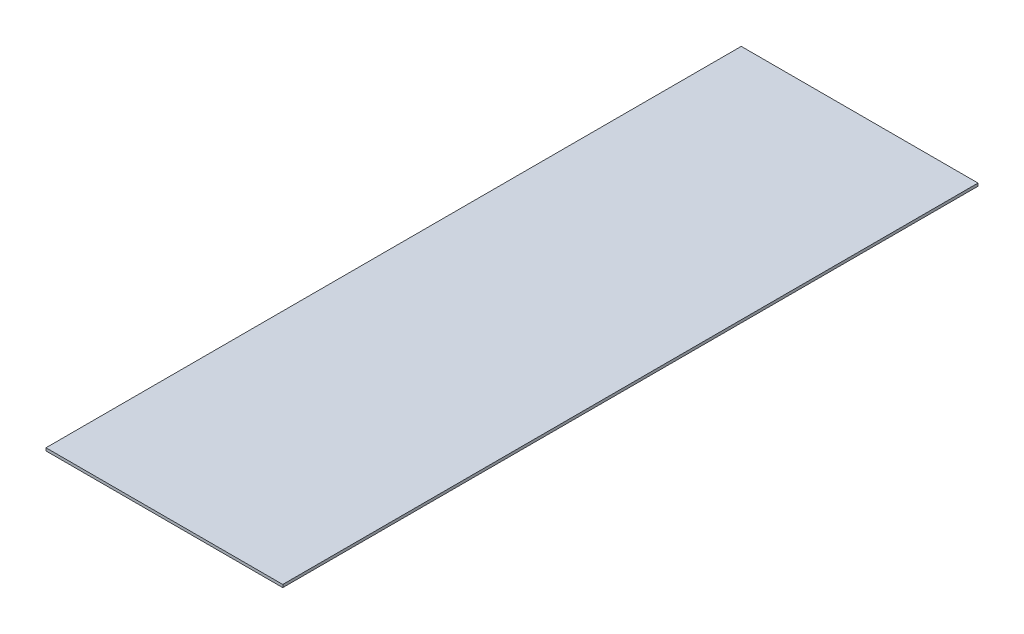
ISO-10303-21;
HEADER;
FILE_DESCRIPTION(('STEP AP214'),'2;1');
FILE_NAME('part.step','',(''),(''),'','','');
FILE_SCHEMA(('AUTOMOTIVE_DESIGN { 1 0 10303 214 1 1 1 1 }'));
ENDSEC;
DATA;
#1=APPLICATION_CONTEXT('core data for automotive mechanical design processes');
#2=APPLICATION_PROTOCOL_DEFINITION('international standard','automotive_design',2000,#1);
#3=PRODUCT_CONTEXT('',#1,'mechanical');
#4=PRODUCT('Part','Part','',(#3));
#5=PRODUCT_RELATED_PRODUCT_CATEGORY('part','',(#4));
#6=PRODUCT_DEFINITION_FORMATION('','',#4);
#7=PRODUCT_DEFINITION_CONTEXT('part definition',#1,'design');
#8=PRODUCT_DEFINITION('design','',#6,#7);
#9=PRODUCT_DEFINITION_SHAPE('','',#8);
#10=(LENGTH_UNIT() NAMED_UNIT(*) SI_UNIT(.MILLI.,.METRE.));
#11=(NAMED_UNIT(*) PLANE_ANGLE_UNIT() SI_UNIT($,.RADIAN.));
#12=(NAMED_UNIT(*) SI_UNIT($,.STERADIAN.) SOLID_ANGLE_UNIT());
#13=UNCERTAINTY_MEASURE_WITH_UNIT(LENGTH_MEASURE(1.E-05),#10,'distance_accuracy_value','');
#14=(GEOMETRIC_REPRESENTATION_CONTEXT(3) GLOBAL_UNCERTAINTY_ASSIGNED_CONTEXT((#13)) GLOBAL_UNIT_ASSIGNED_CONTEXT((#10,
#11,#12)) REPRESENTATION_CONTEXT('',''));
#15=CARTESIAN_POINT('',(0.,0.,0.));
#16=DIRECTION('',(0.,0.,1.));
#17=DIRECTION('',(1.,0.,0.));
#18=AXIS2_PLACEMENT_3D('',#15,#16,#17);
#19=CARTESIAN_POINT('',(0.,2.,0.));
#20=DIRECTION('',(0.,0.,1.));
#21=DIRECTION('',(1.,0.,0.));
#22=AXIS2_PLACEMENT_3D('',#19,#20,#21);
#23=PLANE('',#22);
#24=DIRECTION('',(-1.,0.,0.));
#25=VECTOR('',#24,1.);
#26=CARTESIAN_POINT('',(0.,0.,0.));
#27=LINE('',#26,#25);
#28=CARTESIAN_POINT('',(0.,0.,0.));
#29=VERTEX_POINT('',#28);
#30=CARTESIAN_POINT('',(-170.27,0.,0.));
#31=VERTEX_POINT('',#30);
#32=EDGE_CURVE('E106',#29,#31,#27,.T.);
#33=ORIENTED_EDGE('',*,*,#32,.T.);
#34=DIRECTION('',(0.,-1.,0.));
#35=VECTOR('',#34,1.);
#36=CARTESIAN_POINT('',(-170.27,2.,0.));
#37=LINE('',#36,#35);
#38=CARTESIAN_POINT('',(-170.27,2.,0.));
#39=VERTEX_POINT('',#38);
#40=EDGE_CURVE('E11',#39,#31,#37,.T.);
#41=ORIENTED_EDGE('',*,*,#40,.F.);
#42=DIRECTION('',(-1.,0.,0.));
#43=VECTOR('',#42,1.);
#44=CARTESIAN_POINT('',(0.,2.,0.));
#45=LINE('',#44,#43);
#46=CARTESIAN_POINT('',(0.,2.,0.));
#47=VERTEX_POINT('',#46);
#48=EDGE_CURVE('E94',#47,#39,#45,.T.);
#49=ORIENTED_EDGE('',*,*,#48,.F.);
#50=DIRECTION('',(0.,-1.,0.));
#51=VECTOR('',#50,1.);
#52=CARTESIAN_POINT('',(0.,2.,0.));
#53=LINE('',#52,#51);
#54=EDGE_CURVE('E102',#47,#29,#53,.T.);
#55=ORIENTED_EDGE('',*,*,#54,.T.);
#56=EDGE_LOOP('',(#33,#41,#49,#55));
#57=FACE_BOUND('',#56,.T.);
#58=ADVANCED_FACE('F43',(#57),#23,.F.);
#59=CARTESIAN_POINT('',(-170.27,2.,0.));
#60=DIRECTION('',(1.,0.,0.));
#61=DIRECTION('',(0.,0.,-1.));
#62=AXIS2_PLACEMENT_3D('',#59,#60,#61);
#63=PLANE('',#62);
#64=DIRECTION('',(0.,0.,1.));
#65=VECTOR('',#64,1.);
#66=CARTESIAN_POINT('',(-170.27,0.,0.));
#67=LINE('',#66,#65);
#68=CARTESIAN_POINT('',(-170.27,0.,500.));
#69=VERTEX_POINT('',#68);
#70=EDGE_CURVE('E98',#31,#69,#67,.T.);
#71=ORIENTED_EDGE('',*,*,#70,.T.);
#72=DIRECTION('',(0.,-1.,0.));
#73=VECTOR('',#72,1.);
#74=CARTESIAN_POINT('',(-170.27,2.,500.));
#75=LINE('',#74,#73);
#76=CARTESIAN_POINT('',(-170.27,2.,500.));
#77=VERTEX_POINT('',#76);
#78=EDGE_CURVE('E51',#77,#69,#75,.T.);
#79=ORIENTED_EDGE('',*,*,#78,.F.);
#80=DIRECTION('',(0.,0.,1.));
#81=VECTOR('',#80,1.);
#82=CARTESIAN_POINT('',(-170.27,2.,0.));
#83=LINE('',#82,#81);
#84=EDGE_CURVE('E89',#39,#77,#83,.T.);
#85=ORIENTED_EDGE('',*,*,#84,.F.);
#86=ORIENTED_EDGE('',*,*,#40,.T.);
#87=EDGE_LOOP('',(#71,#79,#85,#86));
#88=FACE_BOUND('',#87,.T.);
#89=ADVANCED_FACE('F97',(#88),#63,.F.);
#90=CARTESIAN_POINT('',(-170.27,2.,500.));
#91=DIRECTION('',(0.,0.,-1.));
#92=DIRECTION('',(-1.,0.,0.));
#93=AXIS2_PLACEMENT_3D('',#90,#91,#92);
#94=PLANE('',#93);
#95=DIRECTION('',(1.,0.,0.));
#96=VECTOR('',#95,1.);
#97=CARTESIAN_POINT('',(-170.27,0.,500.));
#98=LINE('',#97,#96);
#99=CARTESIAN_POINT('',(0.,0.,500.));
#100=VERTEX_POINT('',#99);
#101=EDGE_CURVE('E76',#69,#100,#98,.T.);
#102=ORIENTED_EDGE('',*,*,#101,.T.);
#103=DIRECTION('',(0.,-1.,0.));
#104=VECTOR('',#103,1.);
#105=CARTESIAN_POINT('',(0.,2.,500.));
#106=LINE('',#105,#104);
#107=CARTESIAN_POINT('',(0.,2.,500.));
#108=VERTEX_POINT('',#107);
#109=EDGE_CURVE('E99',#108,#100,#106,.T.);
#110=ORIENTED_EDGE('',*,*,#109,.F.);
#111=DIRECTION('',(1.,0.,0.));
#112=VECTOR('',#111,1.);
#113=CARTESIAN_POINT('',(-170.27,2.,500.));
#114=LINE('',#113,#112);
#115=EDGE_CURVE('E92',#77,#108,#114,.T.);
#116=ORIENTED_EDGE('',*,*,#115,.F.);
#117=ORIENTED_EDGE('',*,*,#78,.T.);
#118=EDGE_LOOP('',(#102,#110,#116,#117));
#119=FACE_BOUND('',#118,.T.);
#120=ADVANCED_FACE('F100',(#119),#94,.F.);
#121=CARTESIAN_POINT('',(0.,2.,500.));
#122=DIRECTION('',(-1.,0.,0.));
#123=DIRECTION('',(0.,0.,1.));
#124=AXIS2_PLACEMENT_3D('',#121,#122,#123);
#125=PLANE('',#124);
#126=DIRECTION('',(0.,0.,-1.));
#127=VECTOR('',#126,1.);
#128=CARTESIAN_POINT('',(0.,0.,500.));
#129=LINE('',#128,#127);
#130=EDGE_CURVE('E82',#100,#29,#129,.T.);
#131=ORIENTED_EDGE('',*,*,#130,.T.);
#132=ORIENTED_EDGE('',*,*,#54,.F.);
#133=DIRECTION('',(0.,0.,-1.));
#134=VECTOR('',#133,1.);
#135=CARTESIAN_POINT('',(0.,2.,500.));
#136=LINE('',#135,#134);
#137=EDGE_CURVE('E59',#108,#47,#136,.T.);
#138=ORIENTED_EDGE('',*,*,#137,.F.);
#139=ORIENTED_EDGE('',*,*,#109,.T.);
#140=EDGE_LOOP('',(#131,#132,#138,#139));
#141=FACE_BOUND('',#140,.T.);
#142=ADVANCED_FACE('F113',(#141),#125,.F.);
#143=CARTESIAN_POINT('',(0.,2.,0.));
#144=DIRECTION('',(0.,1.,0.));
#145=DIRECTION('',(0.,0.,1.));
#146=AXIS2_PLACEMENT_3D('',#143,#144,#145);
#147=PLANE('',#146);
#148=ORIENTED_EDGE('',*,*,#48,.T.);
#149=ORIENTED_EDGE('',*,*,#84,.T.);
#150=ORIENTED_EDGE('',*,*,#115,.T.);
#151=ORIENTED_EDGE('',*,*,#137,.T.);
#152=EDGE_LOOP('',(#148,#149,#150,#151));
#153=FACE_BOUND('',#152,.T.);
#154=ADVANCED_FACE('F90',(#153),#147,.T.);
#155=CARTESIAN_POINT('',(0.,0.,0.));
#156=DIRECTION('',(0.,1.,0.));
#157=DIRECTION('',(0.,0.,1.));
#158=AXIS2_PLACEMENT_3D('',#155,#156,#157);
#159=PLANE('',#158);
#160=ORIENTED_EDGE('',*,*,#32,.F.);
#161=ORIENTED_EDGE('',*,*,#130,.F.);
#162=ORIENTED_EDGE('',*,*,#101,.F.);
#163=ORIENTED_EDGE('',*,*,#70,.F.);
#164=EDGE_LOOP('',(#160,#161,#162,#163));
#165=FACE_BOUND('',#164,.T.);
#166=ADVANCED_FACE('F116',(#165),#159,.F.);
#167=CLOSED_SHELL('',(#58,#89,#120,#142,#154,#166));
#168=MANIFOLD_SOLID_BREP('B2',#167);
#169=ADVANCED_BREP_SHAPE_REPRESENTATION('',(#18,#168),#14);
#170=SHAPE_DEFINITION_REPRESENTATION(#9,#169);
ENDSEC;
END-ISO-10303-21;
